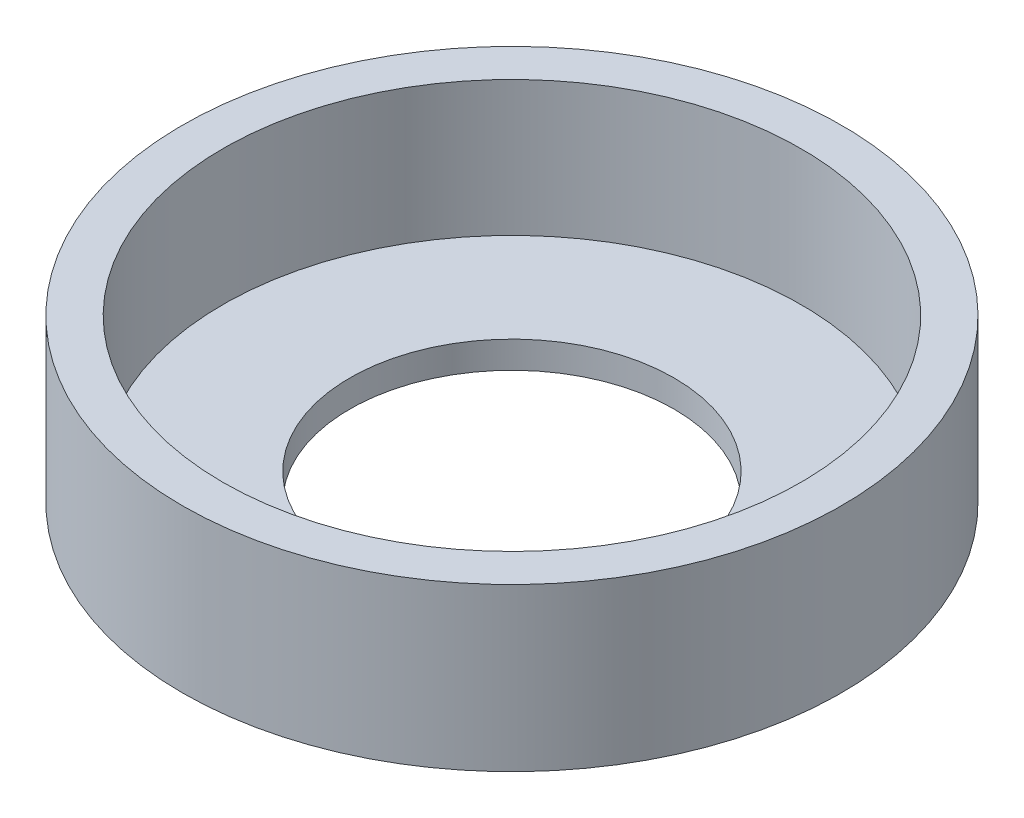
ISO-10303-21;
HEADER;
FILE_DESCRIPTION(('STEP AP214'),'2;1');
FILE_NAME('part.step','',(''),(''),'','','');
FILE_SCHEMA(('AUTOMOTIVE_DESIGN { 1 0 10303 214 1 1 1 1 }'));
ENDSEC;
DATA;
#1=APPLICATION_CONTEXT('core data for automotive mechanical design processes');
#2=APPLICATION_PROTOCOL_DEFINITION('international standard','automotive_design',2000,#1);
#3=PRODUCT_CONTEXT('',#1,'mechanical');
#4=PRODUCT('Part','Part','',(#3));
#5=PRODUCT_RELATED_PRODUCT_CATEGORY('part','',(#4));
#6=PRODUCT_DEFINITION_FORMATION('','',#4);
#7=PRODUCT_DEFINITION_CONTEXT('part definition',#1,'design');
#8=PRODUCT_DEFINITION('design','',#6,#7);
#9=PRODUCT_DEFINITION_SHAPE('','',#8);
#10=(LENGTH_UNIT() NAMED_UNIT(*) SI_UNIT(.MILLI.,.METRE.));
#11=(NAMED_UNIT(*) PLANE_ANGLE_UNIT() SI_UNIT($,.RADIAN.));
#12=(NAMED_UNIT(*) SI_UNIT($,.STERADIAN.) SOLID_ANGLE_UNIT());
#13=UNCERTAINTY_MEASURE_WITH_UNIT(LENGTH_MEASURE(1.E-05),#10,'distance_accuracy_value','');
#14=(GEOMETRIC_REPRESENTATION_CONTEXT(3) GLOBAL_UNCERTAINTY_ASSIGNED_CONTEXT((#13)) GLOBAL_UNIT_ASSIGNED_CONTEXT((#10,
#11,#12)) REPRESENTATION_CONTEXT('',''));
#15=CARTESIAN_POINT('',(0.,0.,0.));
#16=DIRECTION('',(0.,0.,1.));
#17=DIRECTION('',(1.,0.,0.));
#18=AXIS2_PLACEMENT_3D('',#15,#16,#17);
#19=CARTESIAN_POINT('',(0.,3.,10.7));
#20=DIRECTION('',(0.,1.,0.));
#21=DIRECTION('',(0.,0.,1.));
#22=AXIS2_PLACEMENT_3D('',#19,#20,#21);
#23=PLANE('',#22);
#24=CARTESIAN_POINT('',(0.,3.,0.));
#25=DIRECTION('',(0.,1.,0.));
#26=DIRECTION('',(0.,0.,1.));
#27=AXIS2_PLACEMENT_3D('',#24,#25,#26);
#28=CIRCLE('',#27,12.2);
#29=CARTESIAN_POINT('',(0.,3.,12.2));
#30=VERTEX_POINT('',#29);
#31=EDGE_CURVE('E10',#30,#30,#28,.T.);
#32=ORIENTED_EDGE('',*,*,#31,.T.);
#33=EDGE_LOOP('',(#32));
#34=FACE_BOUND('',#33,.T.);
#35=CARTESIAN_POINT('',(0.,3.,0.));
#36=DIRECTION('',(0.,1.,0.));
#37=DIRECTION('',(0.,0.,1.));
#38=AXIS2_PLACEMENT_3D('',#35,#36,#37);
#39=CIRCLE('',#38,10.7);
#40=CARTESIAN_POINT('',(0.,3.,10.7));
#41=VERTEX_POINT('',#40);
#42=EDGE_CURVE('E64',#41,#41,#39,.T.);
#43=ORIENTED_EDGE('',*,*,#42,.F.);
#44=EDGE_LOOP('',(#43));
#45=FACE_BOUND('',#44,.T.);
#46=ADVANCED_FACE('F37',(#34,#45),#23,.T.);
#47=CARTESIAN_POINT('',(0.,27.0772058823529,0.));
#48=DIRECTION('',(0.,1.,0.));
#49=DIRECTION('',(0.,0.,1.));
#50=AXIS2_PLACEMENT_3D('',#47,#48,#49);
#51=CYLINDRICAL_SURFACE('',#50,12.2);
#52=CARTESIAN_POINT('',(0.,-3.,0.));
#53=DIRECTION('',(0.,1.,0.));
#54=DIRECTION('',(0.,0.,1.));
#55=AXIS2_PLACEMENT_3D('',#52,#53,#54);
#56=CIRCLE('',#55,12.2);
#57=CARTESIAN_POINT('',(0.,-3.,12.2));
#58=VERTEX_POINT('',#57);
#59=EDGE_CURVE('E44',#58,#58,#56,.T.);
#60=ORIENTED_EDGE('',*,*,#59,.T.);
#61=EDGE_LOOP('',(#60));
#62=FACE_BOUND('',#61,.T.);
#63=ORIENTED_EDGE('',*,*,#31,.F.);
#64=EDGE_LOOP('',(#63));
#65=FACE_BOUND('',#64,.T.);
#66=ADVANCED_FACE('F73',(#62,#65),#51,.T.);
#67=CARTESIAN_POINT('',(0.,-3.,12.2));
#68=DIRECTION('',(0.,-1.,0.));
#69=DIRECTION('',(0.,0.,-1.));
#70=AXIS2_PLACEMENT_3D('',#67,#68,#69);
#71=PLANE('',#70);
#72=CARTESIAN_POINT('',(0.,-3.,0.));
#73=DIRECTION('',(0.,1.,0.));
#74=DIRECTION('',(0.,0.,1.));
#75=AXIS2_PLACEMENT_3D('',#72,#73,#74);
#76=CIRCLE('',#75,6.);
#77=CARTESIAN_POINT('',(0.,-3.,6.));
#78=VERTEX_POINT('',#77);
#79=EDGE_CURVE('E49',#78,#78,#76,.T.);
#80=ORIENTED_EDGE('',*,*,#79,.T.);
#81=EDGE_LOOP('',(#80));
#82=FACE_BOUND('',#81,.T.);
#83=ORIENTED_EDGE('',*,*,#59,.F.);
#84=EDGE_LOOP('',(#83));
#85=FACE_BOUND('',#84,.T.);
#86=ADVANCED_FACE('F77',(#82,#85),#71,.T.);
#87=CARTESIAN_POINT('',(0.,27.0772058823529,0.));
#88=DIRECTION('',(0.,1.,0.));
#89=DIRECTION('',(0.,0.,1.));
#90=AXIS2_PLACEMENT_3D('',#87,#88,#89);
#91=CYLINDRICAL_SURFACE('',#90,5.99999999999999);
#92=CARTESIAN_POINT('',(0.,-2.,0.));
#93=DIRECTION('',(0.,1.,0.));
#94=DIRECTION('',(0.,0.,1.));
#95=AXIS2_PLACEMENT_3D('',#92,#93,#94);
#96=CIRCLE('',#95,5.99999999999999);
#97=CARTESIAN_POINT('',(0.,-2.,5.99999999999999));
#98=VERTEX_POINT('',#97);
#99=EDGE_CURVE('E54',#98,#98,#96,.T.);
#100=ORIENTED_EDGE('',*,*,#99,.T.);
#101=EDGE_LOOP('',(#100));
#102=FACE_BOUND('',#101,.T.);
#103=ORIENTED_EDGE('',*,*,#79,.F.);
#104=EDGE_LOOP('',(#103));
#105=FACE_BOUND('',#104,.T.);
#106=ADVANCED_FACE('F81',(#102,#105),#91,.F.);
#107=CARTESIAN_POINT('',(0.,-2.,5.99999999999999));
#108=DIRECTION('',(0.,1.,0.));
#109=DIRECTION('',(0.,0.,1.));
#110=AXIS2_PLACEMENT_3D('',#107,#108,#109);
#111=PLANE('',#110);
#112=CARTESIAN_POINT('',(0.,-2.,0.));
#113=DIRECTION('',(0.,1.,0.));
#114=DIRECTION('',(0.,0.,1.));
#115=AXIS2_PLACEMENT_3D('',#112,#113,#114);
#116=CIRCLE('',#115,10.7);
#117=CARTESIAN_POINT('',(0.,-2.,10.7));
#118=VERTEX_POINT('',#117);
#119=EDGE_CURVE('E60',#118,#118,#116,.T.);
#120=ORIENTED_EDGE('',*,*,#119,.T.);
#121=EDGE_LOOP('',(#120));
#122=FACE_BOUND('',#121,.T.);
#123=ORIENTED_EDGE('',*,*,#99,.F.);
#124=EDGE_LOOP('',(#123));
#125=FACE_BOUND('',#124,.T.);
#126=ADVANCED_FACE('F88',(#122,#125),#111,.T.);
#127=CARTESIAN_POINT('',(0.,27.0772058823529,0.));
#128=DIRECTION('',(0.,1.,0.));
#129=DIRECTION('',(0.,0.,1.));
#130=AXIS2_PLACEMENT_3D('',#127,#128,#129);
#131=CYLINDRICAL_SURFACE('',#130,10.7);
#132=ORIENTED_EDGE('',*,*,#42,.T.);
#133=EDGE_LOOP('',(#132));
#134=FACE_BOUND('',#133,.T.);
#135=ORIENTED_EDGE('',*,*,#119,.F.);
#136=EDGE_LOOP('',(#135));
#137=FACE_BOUND('',#136,.T.);
#138=ADVANCED_FACE('F69',(#134,#137),#131,.F.);
#139=CLOSED_SHELL('',(#46,#66,#86,#106,#126,#138));
#140=MANIFOLD_SOLID_BREP('B2',#139);
#141=ADVANCED_BREP_SHAPE_REPRESENTATION('',(#18,#140),#14);
#142=SHAPE_DEFINITION_REPRESENTATION(#9,#141);
ENDSEC;
END-ISO-10303-21;
